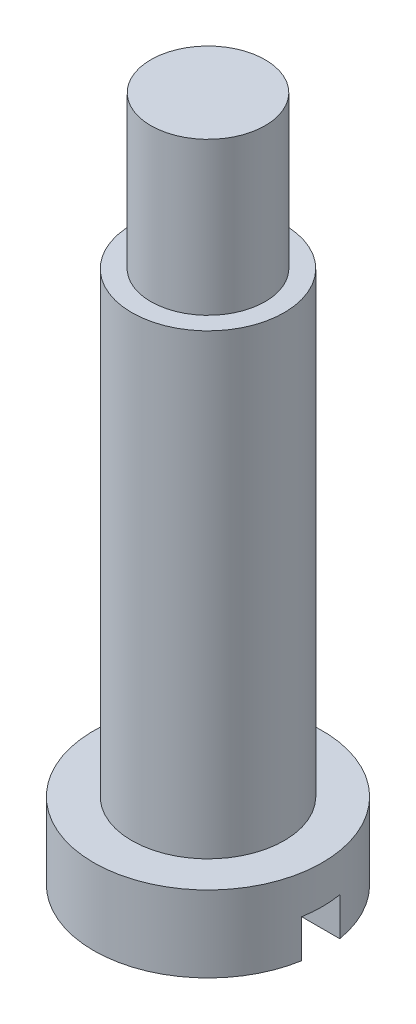
ISO-10303-21;
HEADER;
FILE_DESCRIPTION(('STEP AP214'),'2;1');
FILE_NAME('part.step','',(''),(''),'','','');
FILE_SCHEMA(('AUTOMOTIVE_DESIGN { 1 0 10303 214 1 1 1 1 }'));
ENDSEC;
DATA;
#1=APPLICATION_CONTEXT('core data for automotive mechanical design processes');
#2=APPLICATION_PROTOCOL_DEFINITION('international standard','automotive_design',2000,#1);
#3=PRODUCT_CONTEXT('',#1,'mechanical');
#4=PRODUCT('Part','Part','',(#3));
#5=PRODUCT_RELATED_PRODUCT_CATEGORY('part','',(#4));
#6=PRODUCT_DEFINITION_FORMATION('','',#4);
#7=PRODUCT_DEFINITION_CONTEXT('part definition',#1,'design');
#8=PRODUCT_DEFINITION('design','',#6,#7);
#9=PRODUCT_DEFINITION_SHAPE('','',#8);
#10=(LENGTH_UNIT() NAMED_UNIT(*) SI_UNIT(.MILLI.,.METRE.));
#11=(NAMED_UNIT(*) PLANE_ANGLE_UNIT() SI_UNIT($,.RADIAN.));
#12=(NAMED_UNIT(*) SI_UNIT($,.STERADIAN.) SOLID_ANGLE_UNIT());
#13=UNCERTAINTY_MEASURE_WITH_UNIT(LENGTH_MEASURE(1.E-05),#10,'distance_accuracy_value','');
#14=(GEOMETRIC_REPRESENTATION_CONTEXT(3) GLOBAL_UNCERTAINTY_ASSIGNED_CONTEXT((#13)) GLOBAL_UNIT_ASSIGNED_CONTEXT((#10,
#11,#12)) REPRESENTATION_CONTEXT('',''));
#15=CARTESIAN_POINT('',(0.,0.,0.));
#16=DIRECTION('',(0.,0.,1.));
#17=DIRECTION('',(1.,0.,0.));
#18=AXIS2_PLACEMENT_3D('',#15,#16,#17);
#19=CARTESIAN_POINT('',(0.,-2.,0.));
#20=DIRECTION('',(0.,1.,0.));
#21=DIRECTION('',(0.,0.,1.));
#22=AXIS2_PLACEMENT_3D('',#19,#20,#21);
#23=CYLINDRICAL_SURFACE('',#22,3.);
#24=CARTESIAN_POINT('',(0.,0.,0.));
#25=DIRECTION('',(0.,1.,0.));
#26=DIRECTION('',(0.,0.,1.));
#27=AXIS2_PLACEMENT_3D('',#24,#25,#26);
#28=CIRCLE('',#27,3.);
#29=CARTESIAN_POINT('',(0.,0.,3.));
#30=VERTEX_POINT('',#29);
#31=EDGE_CURVE('E114',#30,#30,#28,.T.);
#32=ORIENTED_EDGE('',*,*,#31,.F.);
#33=EDGE_LOOP('',(#32));
#34=FACE_BOUND('',#33,.T.);
#35=CARTESIAN_POINT('',(0.,-2.,0.));
#36=DIRECTION('',(0.,1.,0.));
#37=DIRECTION('',(0.,0.,1.));
#38=AXIS2_PLACEMENT_3D('',#35,#36,#37);
#39=CIRCLE('',#38,3.);
#40=CARTESIAN_POINT('',(2.95803989154981,-2.,-0.5));
#41=VERTEX_POINT('',#40);
#42=CARTESIAN_POINT('',(-2.95803989154981,-2.,-0.5));
#43=VERTEX_POINT('',#42);
#44=EDGE_CURVE('E117',#41,#43,#39,.T.);
#45=ORIENTED_EDGE('',*,*,#44,.T.);
#46=DIRECTION('',(0.,1.,0.));
#47=VECTOR('',#46,1.);
#48=CARTESIAN_POINT('',(-2.95803989154981,-2.,-0.5));
#49=LINE('',#48,#47);
#50=CARTESIAN_POINT('',(-2.95803989154981,-1.,-0.5));
#51=VERTEX_POINT('',#50);
#52=EDGE_CURVE('E86',#43,#51,#49,.T.);
#53=ORIENTED_EDGE('',*,*,#52,.T.);
#54=CARTESIAN_POINT('',(0.,-1.,0.));
#55=DIRECTION('',(0.,1.,0.));
#56=DIRECTION('',(0.,0.,1.));
#57=AXIS2_PLACEMENT_3D('',#54,#55,#56);
#58=CIRCLE('',#57,3.);
#59=CARTESIAN_POINT('',(-2.95803989154981,-1.,0.5));
#60=VERTEX_POINT('',#59);
#61=EDGE_CURVE('E11',#60,#51,#58,.F.);
#62=ORIENTED_EDGE('',*,*,#61,.F.);
#63=DIRECTION('',(0.,1.,0.));
#64=VECTOR('',#63,1.);
#65=CARTESIAN_POINT('',(-2.95803989154981,-2.,0.5));
#66=LINE('',#65,#64);
#67=CARTESIAN_POINT('',(-2.95803989154981,-2.,0.5));
#68=VERTEX_POINT('',#67);
#69=EDGE_CURVE('E84',#68,#60,#66,.T.);
#70=ORIENTED_EDGE('',*,*,#69,.F.);
#71=CARTESIAN_POINT('',(2.95803989154981,-2.,0.5));
#72=VERTEX_POINT('',#71);
#73=EDGE_CURVE('E118',#68,#72,#39,.T.);
#74=ORIENTED_EDGE('',*,*,#73,.T.);
#75=DIRECTION('',(0.,1.,0.));
#76=VECTOR('',#75,1.);
#77=CARTESIAN_POINT('',(2.95803989154981,-2.,0.5));
#78=LINE('',#77,#76);
#79=CARTESIAN_POINT('',(2.95803989154981,-1.,0.5));
#80=VERTEX_POINT('',#79);
#81=EDGE_CURVE('E54',#80,#72,#78,.F.);
#82=ORIENTED_EDGE('',*,*,#81,.F.);
#83=CARTESIAN_POINT('',(2.95803989154981,-1.,-0.5));
#84=VERTEX_POINT('',#83);
#85=EDGE_CURVE('E43',#84,#80,#58,.F.);
#86=ORIENTED_EDGE('',*,*,#85,.F.);
#87=DIRECTION('',(0.,1.,0.));
#88=VECTOR('',#87,1.);
#89=CARTESIAN_POINT('',(2.95803989154981,-2.,-0.5));
#90=LINE('',#89,#88);
#91=EDGE_CURVE('E102',#84,#41,#90,.F.);
#92=ORIENTED_EDGE('',*,*,#91,.T.);
#93=EDGE_LOOP('',(#45,#53,#62,#70,#74,#82,#86,#92));
#94=FACE_BOUND('',#93,.T.);
#95=ADVANCED_FACE('F40',(#34,#94),#23,.T.);
#96=CARTESIAN_POINT('',(0.,-2.,0.));
#97=DIRECTION('',(0.,1.,0.));
#98=DIRECTION('',(0.,0.,1.));
#99=AXIS2_PLACEMENT_3D('',#96,#97,#98);
#100=PLANE('',#99);
#101=DIRECTION('',(1.,0.,0.));
#102=VECTOR('',#101,1.);
#103=CARTESIAN_POINT('',(0.,-2.,-0.5));
#104=LINE('',#103,#102);
#105=EDGE_CURVE('E62',#43,#41,#104,.T.);
#106=ORIENTED_EDGE('',*,*,#105,.F.);
#107=ORIENTED_EDGE('',*,*,#44,.F.);
#108=EDGE_LOOP('',(#106,#107));
#109=FACE_BOUND('',#108,.T.);
#110=ADVANCED_FACE('F127',(#109),#100,.F.);
#111=ORIENTED_EDGE('',*,*,#73,.F.);
#112=DIRECTION('',(1.,0.,0.));
#113=VECTOR('',#112,1.);
#114=CARTESIAN_POINT('',(0.,-2.,0.5));
#115=LINE('',#114,#113);
#116=EDGE_CURVE('E93',#68,#72,#115,.T.);
#117=ORIENTED_EDGE('',*,*,#116,.T.);
#118=EDGE_LOOP('',(#111,#117));
#119=FACE_BOUND('',#118,.T.);
#120=ADVANCED_FACE('F123',(#119),#100,.F.);
#121=CARTESIAN_POINT('',(0.,0.,0.));
#122=DIRECTION('',(0.,1.,0.));
#123=DIRECTION('',(0.,0.,1.));
#124=AXIS2_PLACEMENT_3D('',#121,#122,#123);
#125=PLANE('',#124);
#126=CARTESIAN_POINT('',(0.,0.,0.));
#127=DIRECTION('',(0.,1.,0.));
#128=DIRECTION('',(0.,0.,1.));
#129=AXIS2_PLACEMENT_3D('',#126,#127,#128);
#130=CIRCLE('',#129,2.);
#131=CARTESIAN_POINT('',(0.,0.,2.));
#132=VERTEX_POINT('',#131);
#133=EDGE_CURVE('E111',#132,#132,#130,.T.);
#134=ORIENTED_EDGE('',*,*,#133,.F.);
#135=EDGE_LOOP('',(#134));
#136=FACE_BOUND('',#135,.T.);
#137=ORIENTED_EDGE('',*,*,#31,.T.);
#138=EDGE_LOOP('',(#137));
#139=FACE_BOUND('',#138,.T.);
#140=ADVANCED_FACE('F134',(#136,#139),#125,.T.);
#141=CARTESIAN_POINT('',(0.,12.,0.));
#142=DIRECTION('',(0.,-1.,0.));
#143=DIRECTION('',(0.,0.,-1.));
#144=AXIS2_PLACEMENT_3D('',#141,#142,#143);
#145=CYLINDRICAL_SURFACE('',#144,2.);
#146=CARTESIAN_POINT('',(0.,12.,0.));
#147=DIRECTION('',(0.,1.,0.));
#148=DIRECTION('',(0.,0.,1.));
#149=AXIS2_PLACEMENT_3D('',#146,#147,#148);
#150=CIRCLE('',#149,2.);
#151=CARTESIAN_POINT('',(0.,12.,2.));
#152=VERTEX_POINT('',#151);
#153=EDGE_CURVE('E107',#152,#152,#150,.T.);
#154=ORIENTED_EDGE('',*,*,#153,.F.);
#155=EDGE_LOOP('',(#154));
#156=FACE_BOUND('',#155,.T.);
#157=ORIENTED_EDGE('',*,*,#133,.T.);
#158=EDGE_LOOP('',(#157));
#159=FACE_BOUND('',#158,.T.);
#160=ADVANCED_FACE('F137',(#156,#159),#145,.T.);
#161=CARTESIAN_POINT('',(0.,12.,0.));
#162=DIRECTION('',(0.,1.,0.));
#163=DIRECTION('',(0.,0.,1.));
#164=AXIS2_PLACEMENT_3D('',#161,#162,#163);
#165=PLANE('',#164);
#166=CARTESIAN_POINT('',(0.,12.,0.));
#167=DIRECTION('',(0.,1.,0.));
#168=DIRECTION('',(0.,0.,1.));
#169=AXIS2_PLACEMENT_3D('',#166,#167,#168);
#170=CIRCLE('',#169,1.5);
#171=CARTESIAN_POINT('',(0.,12.,1.5));
#172=VERTEX_POINT('',#171);
#173=EDGE_CURVE('E108',#172,#172,#170,.T.);
#174=ORIENTED_EDGE('',*,*,#173,.F.);
#175=EDGE_LOOP('',(#174));
#176=FACE_BOUND('',#175,.T.);
#177=ORIENTED_EDGE('',*,*,#153,.T.);
#178=EDGE_LOOP('',(#177));
#179=FACE_BOUND('',#178,.T.);
#180=ADVANCED_FACE('F144',(#176,#179),#165,.T.);
#181=CARTESIAN_POINT('',(0.,16.,0.));
#182=DIRECTION('',(0.,-1.,0.));
#183=DIRECTION('',(0.,0.,-1.));
#184=AXIS2_PLACEMENT_3D('',#181,#182,#183);
#185=CYLINDRICAL_SURFACE('',#184,1.5);
#186=CARTESIAN_POINT('',(0.,16.,0.));
#187=DIRECTION('',(0.,1.,0.));
#188=DIRECTION('',(0.,0.,1.));
#189=AXIS2_PLACEMENT_3D('',#186,#187,#188);
#190=CIRCLE('',#189,1.5);
#191=CARTESIAN_POINT('',(0.,16.,1.5));
#192=VERTEX_POINT('',#191);
#193=EDGE_CURVE('E104',#192,#192,#190,.T.);
#194=ORIENTED_EDGE('',*,*,#193,.F.);
#195=EDGE_LOOP('',(#194));
#196=FACE_BOUND('',#195,.T.);
#197=ORIENTED_EDGE('',*,*,#173,.T.);
#198=EDGE_LOOP('',(#197));
#199=FACE_BOUND('',#198,.T.);
#200=ADVANCED_FACE('F153',(#196,#199),#185,.T.);
#201=CARTESIAN_POINT('',(0.,16.,0.));
#202=DIRECTION('',(0.,1.,0.));
#203=DIRECTION('',(0.,0.,1.));
#204=AXIS2_PLACEMENT_3D('',#201,#202,#203);
#205=PLANE('',#204);
#206=ORIENTED_EDGE('',*,*,#193,.T.);
#207=EDGE_LOOP('',(#206));
#208=FACE_BOUND('',#207,.T.);
#209=ADVANCED_FACE('F160',(#208),#205,.T.);
#210=CARTESIAN_POINT('',(-3.,-2.000012,-0.5));
#211=DIRECTION('',(0.,0.,1.));
#212=DIRECTION('',(1.,0.,0.));
#213=AXIS2_PLACEMENT_3D('',#210,#211,#212);
#214=PLANE('',#213);
#215=DIRECTION('',(1.,0.,0.));
#216=VECTOR('',#215,1.);
#217=CARTESIAN_POINT('',(-3.,-1.,-0.5));
#218=LINE('',#217,#216);
#219=EDGE_CURVE('E96',#51,#84,#218,.T.);
#220=ORIENTED_EDGE('',*,*,#219,.F.);
#221=ORIENTED_EDGE('',*,*,#52,.F.);
#222=ORIENTED_EDGE('',*,*,#105,.T.);
#223=ORIENTED_EDGE('',*,*,#91,.F.);
#224=EDGE_LOOP('',(#220,#221,#222,#223));
#225=FACE_BOUND('',#224,.T.);
#226=ADVANCED_FACE('F125',(#225),#214,.T.);
#227=CARTESIAN_POINT('',(-3.,-2.000012,0.5));
#228=DIRECTION('',(0.,0.,1.));
#229=DIRECTION('',(1.,0.,0.));
#230=AXIS2_PLACEMENT_3D('',#227,#228,#229);
#231=PLANE('',#230);
#232=ORIENTED_EDGE('',*,*,#81,.T.);
#233=ORIENTED_EDGE('',*,*,#116,.F.);
#234=ORIENTED_EDGE('',*,*,#69,.T.);
#235=DIRECTION('',(1.,0.,0.));
#236=VECTOR('',#235,1.);
#237=CARTESIAN_POINT('',(-3.,-1.,0.5));
#238=LINE('',#237,#236);
#239=EDGE_CURVE('E92',#60,#80,#238,.T.);
#240=ORIENTED_EDGE('',*,*,#239,.T.);
#241=EDGE_LOOP('',(#232,#233,#234,#240));
#242=FACE_BOUND('',#241,.T.);
#243=ADVANCED_FACE('F91',(#242),#231,.F.);
#244=CARTESIAN_POINT('',(0.,-1.,0.));
#245=DIRECTION('',(0.,1.,0.));
#246=DIRECTION('',(-1.,0.,0.));
#247=AXIS2_PLACEMENT_3D('',#244,#245,#246);
#248=PLANE('',#247);
#249=ORIENTED_EDGE('',*,*,#239,.F.);
#250=ORIENTED_EDGE('',*,*,#61,.T.);
#251=ORIENTED_EDGE('',*,*,#219,.T.);
#252=ORIENTED_EDGE('',*,*,#85,.T.);
#253=EDGE_LOOP('',(#249,#250,#251,#252));
#254=FACE_BOUND('',#253,.T.);
#255=ADVANCED_FACE('F95',(#254),#248,.F.);
#256=CLOSED_SHELL('',(#95,#110,#120,#140,#160,#180,#200,#209,#226,#243,#255));
#257=MANIFOLD_SOLID_BREP('B2',#256);
#258=ADVANCED_BREP_SHAPE_REPRESENTATION('',(#18,#257),#14);
#259=SHAPE_DEFINITION_REPRESENTATION(#9,#258);
ENDSEC;
END-ISO-10303-21;
